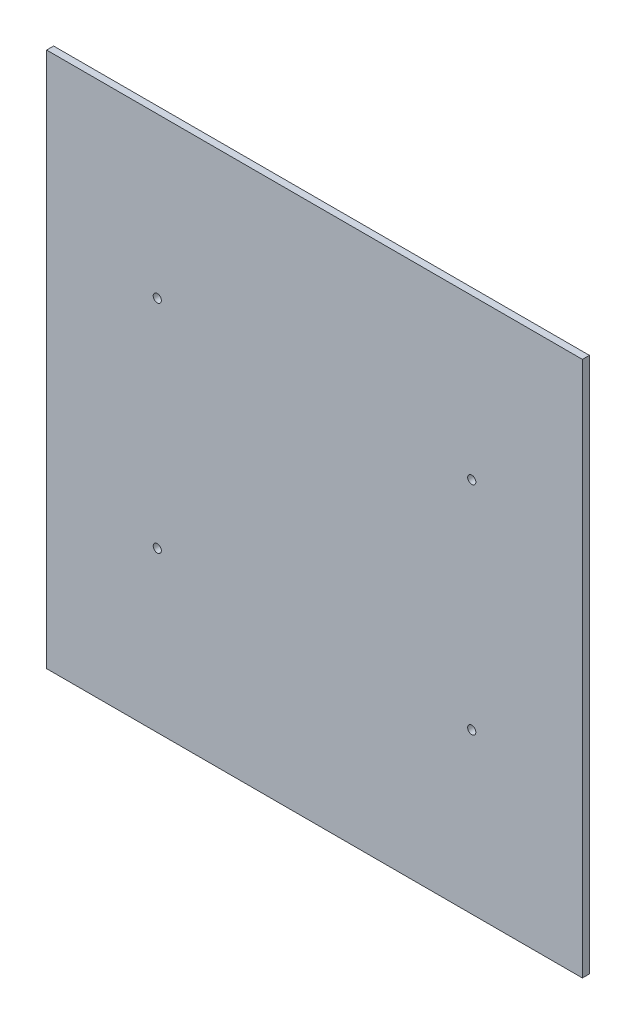
ISO-10303-21;
HEADER;
FILE_DESCRIPTION(('STEP AP214'),'2;1');
FILE_NAME('part.step','',(''),(''),'','','');
FILE_SCHEMA(('AUTOMOTIVE_DESIGN { 1 0 10303 214 1 1 1 1 }'));
ENDSEC;
DATA;
#1=APPLICATION_CONTEXT('core data for automotive mechanical design processes');
#2=APPLICATION_PROTOCOL_DEFINITION('international standard','automotive_design',2000,#1);
#3=PRODUCT_CONTEXT('',#1,'mechanical');
#4=PRODUCT('Part','Part','',(#3));
#5=PRODUCT_RELATED_PRODUCT_CATEGORY('part','',(#4));
#6=PRODUCT_DEFINITION_FORMATION('','',#4);
#7=PRODUCT_DEFINITION_CONTEXT('part definition',#1,'design');
#8=PRODUCT_DEFINITION('design','',#6,#7);
#9=PRODUCT_DEFINITION_SHAPE('','',#8);
#10=(LENGTH_UNIT() NAMED_UNIT(*) SI_UNIT(.MILLI.,.METRE.));
#11=(NAMED_UNIT(*) PLANE_ANGLE_UNIT() SI_UNIT($,.RADIAN.));
#12=(NAMED_UNIT(*) SI_UNIT($,.STERADIAN.) SOLID_ANGLE_UNIT());
#13=UNCERTAINTY_MEASURE_WITH_UNIT(LENGTH_MEASURE(1.E-05),#10,'distance_accuracy_value','');
#14=(GEOMETRIC_REPRESENTATION_CONTEXT(3) GLOBAL_UNCERTAINTY_ASSIGNED_CONTEXT((#13)) GLOBAL_UNIT_ASSIGNED_CONTEXT((#10,
#11,#12)) REPRESENTATION_CONTEXT('',''));
#15=CARTESIAN_POINT('',(0.,0.,0.));
#16=DIRECTION('',(0.,0.,1.));
#17=DIRECTION('',(1.,0.,0.));
#18=AXIS2_PLACEMENT_3D('',#15,#16,#17);
#19=CARTESIAN_POINT('',(-198.312913378607,43.3479344980651,3.));
#20=DIRECTION('',(1.,0.,0.));
#21=DIRECTION('',(0.,1.,0.));
#22=AXIS2_PLACEMENT_3D('',#19,#20,#21);
#23=PLANE('',#22);
#24=DIRECTION('',(0.,-1.,0.));
#25=VECTOR('',#24,1.);
#26=CARTESIAN_POINT('',(-198.312913378607,43.3479344980651,0.));
#27=LINE('',#26,#25);
#28=CARTESIAN_POINT('',(-198.312913378607,43.3479344980651,0.));
#29=VERTEX_POINT('',#28);
#30=CARTESIAN_POINT('',(-198.312913378607,-186.652065501935,0.));
#31=VERTEX_POINT('',#30);
#32=EDGE_CURVE('E98',#29,#31,#27,.T.);
#33=ORIENTED_EDGE('',*,*,#32,.T.);
#34=DIRECTION('',(0.,0.,-1.));
#35=VECTOR('',#34,1.);
#36=CARTESIAN_POINT('',(-198.312913378607,-186.652065501935,3.));
#37=LINE('',#36,#35);
#38=CARTESIAN_POINT('',(-198.312913378607,-186.652065501935,3.));
#39=VERTEX_POINT('',#38);
#40=EDGE_CURVE('E11',#39,#31,#37,.T.);
#41=ORIENTED_EDGE('',*,*,#40,.F.);
#42=DIRECTION('',(0.,-1.,0.));
#43=VECTOR('',#42,1.);
#44=CARTESIAN_POINT('',(-198.312913378607,43.3479344980651,3.));
#45=LINE('',#44,#43);
#46=CARTESIAN_POINT('',(-198.312913378607,43.3479344980651,3.));
#47=VERTEX_POINT('',#46);
#48=EDGE_CURVE('E85',#47,#39,#45,.T.);
#49=ORIENTED_EDGE('',*,*,#48,.F.);
#50=DIRECTION('',(0.,0.,-1.));
#51=VECTOR('',#50,1.);
#52=CARTESIAN_POINT('',(-198.312913378607,43.3479344980651,3.));
#53=LINE('',#52,#51);
#54=EDGE_CURVE('E94',#47,#29,#53,.T.);
#55=ORIENTED_EDGE('',*,*,#54,.T.);
#56=EDGE_LOOP('',(#33,#41,#49,#55));
#57=FACE_BOUND('',#56,.T.);
#58=ADVANCED_FACE('F32',(#57),#23,.F.);
#59=CARTESIAN_POINT('',(-198.312913378607,-186.652065501935,3.));
#60=DIRECTION('',(0.,1.,0.));
#61=DIRECTION('',(0.,0.,1.));
#62=AXIS2_PLACEMENT_3D('',#59,#60,#61);
#63=PLANE('',#62);
#64=DIRECTION('',(1.,0.,0.));
#65=VECTOR('',#64,1.);
#66=CARTESIAN_POINT('',(-198.312913378607,-186.652065501935,0.));
#67=LINE('',#66,#65);
#68=CARTESIAN_POINT('',(31.6870866213926,-186.652065501935,0.));
#69=VERTEX_POINT('',#68);
#70=EDGE_CURVE('E89',#31,#69,#67,.T.);
#71=ORIENTED_EDGE('',*,*,#70,.T.);
#72=DIRECTION('',(0.,0.,-1.));
#73=VECTOR('',#72,1.);
#74=CARTESIAN_POINT('',(31.6870866213926,-186.652065501935,3.));
#75=LINE('',#74,#73);
#76=CARTESIAN_POINT('',(31.6870866213926,-186.652065501935,3.));
#77=VERTEX_POINT('',#76);
#78=EDGE_CURVE('E41',#77,#69,#75,.T.);
#79=ORIENTED_EDGE('',*,*,#78,.F.);
#80=DIRECTION('',(1.,0.,0.));
#81=VECTOR('',#80,1.);
#82=CARTESIAN_POINT('',(-198.312913378607,-186.652065501935,3.));
#83=LINE('',#82,#81);
#84=EDGE_CURVE('E80',#39,#77,#83,.T.);
#85=ORIENTED_EDGE('',*,*,#84,.F.);
#86=ORIENTED_EDGE('',*,*,#40,.T.);
#87=EDGE_LOOP('',(#71,#79,#85,#86));
#88=FACE_BOUND('',#87,.T.);
#89=ADVANCED_FACE('F88',(#88),#63,.F.);
#90=CARTESIAN_POINT('',(31.6870866213926,43.3479344980651,3.));
#91=DIRECTION('',(-1.,0.,0.));
#92=DIRECTION('',(0.,-1.,0.));
#93=AXIS2_PLACEMENT_3D('',#90,#91,#92);
#94=PLANE('',#93);
#95=DIRECTION('',(0.,1.,0.));
#96=VECTOR('',#95,1.);
#97=CARTESIAN_POINT('',(31.6870866213926,43.3479344980651,0.));
#98=LINE('',#97,#96);
#99=CARTESIAN_POINT('',(31.6870866213926,43.3479344980651,0.));
#100=VERTEX_POINT('',#99);
#101=EDGE_CURVE('E67',#69,#100,#98,.T.);
#102=ORIENTED_EDGE('',*,*,#101,.T.);
#103=DIRECTION('',(0.,0.,-1.));
#104=VECTOR('',#103,1.);
#105=CARTESIAN_POINT('',(31.6870866213926,43.3479344980651,3.));
#106=LINE('',#105,#104);
#107=CARTESIAN_POINT('',(31.6870866213926,43.3479344980651,3.));
#108=VERTEX_POINT('',#107);
#109=EDGE_CURVE('E90',#108,#100,#106,.T.);
#110=ORIENTED_EDGE('',*,*,#109,.F.);
#111=DIRECTION('',(0.,1.,0.));
#112=VECTOR('',#111,1.);
#113=CARTESIAN_POINT('',(31.6870866213926,43.3479344980651,3.));
#114=LINE('',#113,#112);
#115=EDGE_CURVE('E83',#77,#108,#114,.T.);
#116=ORIENTED_EDGE('',*,*,#115,.F.);
#117=ORIENTED_EDGE('',*,*,#78,.T.);
#118=EDGE_LOOP('',(#102,#110,#116,#117));
#119=FACE_BOUND('',#118,.T.);
#120=ADVANCED_FACE('F92',(#119),#94,.F.);
#121=CARTESIAN_POINT('',(-198.312913378607,43.3479344980651,3.));
#122=DIRECTION('',(0.,-1.,0.));
#123=DIRECTION('',(0.,0.,-1.));
#124=AXIS2_PLACEMENT_3D('',#121,#122,#123);
#125=PLANE('',#124);
#126=DIRECTION('',(-1.,0.,0.));
#127=VECTOR('',#126,1.);
#128=CARTESIAN_POINT('',(-198.312913378607,43.3479344980651,0.));
#129=LINE('',#128,#127);
#130=EDGE_CURVE('E73',#100,#29,#129,.T.);
#131=ORIENTED_EDGE('',*,*,#130,.T.);
#132=ORIENTED_EDGE('',*,*,#54,.F.);
#133=DIRECTION('',(-1.,0.,0.));
#134=VECTOR('',#133,1.);
#135=CARTESIAN_POINT('',(-198.312913378607,43.3479344980651,3.));
#136=LINE('',#135,#134);
#137=EDGE_CURVE('E50',#108,#47,#136,.T.);
#138=ORIENTED_EDGE('',*,*,#137,.F.);
#139=ORIENTED_EDGE('',*,*,#109,.T.);
#140=EDGE_LOOP('',(#131,#132,#138,#139));
#141=FACE_BOUND('',#140,.T.);
#142=ADVANCED_FACE('F136',(#141),#125,.F.);
#143=CARTESIAN_POINT('',(0.,0.,3.));
#144=DIRECTION('',(0.,0.,1.));
#145=DIRECTION('',(1.,0.,0.));
#146=AXIS2_PLACEMENT_3D('',#143,#144,#145);
#147=PLANE('',#146);
#148=CARTESIAN_POINT('',(-150.812913378607,-25.1520655019349,3.));
#149=DIRECTION('',(0.,0.,1.));
#150=DIRECTION('',(1.,0.,0.));
#151=AXIS2_PLACEMENT_3D('',#148,#149,#150);
#152=CIRCLE('',#151,1.75000000000001);
#153=CARTESIAN_POINT('',(-149.062913378607,-25.1520655019349,3.));
#154=VERTEX_POINT('',#153);
#155=EDGE_CURVE('E125',#154,#154,#152,.T.);
#156=ORIENTED_EDGE('',*,*,#155,.F.);
#157=EDGE_LOOP('',(#156));
#158=FACE_BOUND('',#157,.T.);
#159=CARTESIAN_POINT('',(-150.812913378607,-118.152065501935,3.));
#160=DIRECTION('',(0.,0.,1.));
#161=DIRECTION('',(1.,0.,0.));
#162=AXIS2_PLACEMENT_3D('',#159,#160,#161);
#163=CIRCLE('',#162,1.75000000000001);
#164=CARTESIAN_POINT('',(-149.062913378607,-118.152065501935,3.));
#165=VERTEX_POINT('',#164);
#166=EDGE_CURVE('E115',#165,#165,#163,.T.);
#167=ORIENTED_EDGE('',*,*,#166,.F.);
#168=EDGE_LOOP('',(#167));
#169=FACE_BOUND('',#168,.T.);
#170=CARTESIAN_POINT('',(-15.8129133786074,-118.152065501935,3.));
#171=DIRECTION('',(0.,0.,1.));
#172=DIRECTION('',(1.,0.,0.));
#173=AXIS2_PLACEMENT_3D('',#170,#171,#172);
#174=CIRCLE('',#173,1.75);
#175=CARTESIAN_POINT('',(-14.0629133786074,-118.152065501935,3.));
#176=VERTEX_POINT('',#175);
#177=EDGE_CURVE('E112',#176,#176,#174,.T.);
#178=ORIENTED_EDGE('',*,*,#177,.F.);
#179=EDGE_LOOP('',(#178));
#180=FACE_BOUND('',#179,.T.);
#181=CARTESIAN_POINT('',(-15.8129133786074,-25.1520655019349,3.));
#182=DIRECTION('',(0.,0.,1.));
#183=DIRECTION('',(1.,0.,0.));
#184=AXIS2_PLACEMENT_3D('',#181,#182,#183);
#185=CIRCLE('',#184,1.75);
#186=CARTESIAN_POINT('',(-14.0629133786074,-25.1520655019349,3.));
#187=VERTEX_POINT('',#186);
#188=EDGE_CURVE('E109',#187,#187,#185,.T.);
#189=ORIENTED_EDGE('',*,*,#188,.F.);
#190=EDGE_LOOP('',(#189));
#191=FACE_BOUND('',#190,.T.);
#192=ORIENTED_EDGE('',*,*,#48,.T.);
#193=ORIENTED_EDGE('',*,*,#84,.T.);
#194=ORIENTED_EDGE('',*,*,#115,.T.);
#195=ORIENTED_EDGE('',*,*,#137,.T.);
#196=EDGE_LOOP('',(#192,#193,#194,#195));
#197=FACE_BOUND('',#196,.T.);
#198=ADVANCED_FACE('F81',(#158,#169,#180,#191,#197),#147,.T.);
#199=CARTESIAN_POINT('',(0.,0.,0.));
#200=DIRECTION('',(0.,0.,1.));
#201=DIRECTION('',(1.,0.,0.));
#202=AXIS2_PLACEMENT_3D('',#199,#200,#201);
#203=PLANE('',#202);
#204=CARTESIAN_POINT('',(-150.812913378607,-25.1520655019349,0.));
#205=DIRECTION('',(0.,0.,1.));
#206=DIRECTION('',(1.,0.,0.));
#207=AXIS2_PLACEMENT_3D('',#204,#205,#206);
#208=CIRCLE('',#207,1.75000000000001);
#209=CARTESIAN_POINT('',(-149.062913378607,-25.1520655019349,0.));
#210=VERTEX_POINT('',#209);
#211=EDGE_CURVE('E35',#210,#210,#208,.T.);
#212=ORIENTED_EDGE('',*,*,#211,.T.);
#213=EDGE_LOOP('',(#212));
#214=FACE_BOUND('',#213,.T.);
#215=CARTESIAN_POINT('',(-150.812913378607,-118.152065501935,0.));
#216=DIRECTION('',(0.,0.,1.));
#217=DIRECTION('',(1.,0.,0.));
#218=AXIS2_PLACEMENT_3D('',#215,#216,#217);
#219=CIRCLE('',#218,1.75000000000001);
#220=CARTESIAN_POINT('',(-149.062913378607,-118.152065501935,0.));
#221=VERTEX_POINT('',#220);
#222=EDGE_CURVE('E113',#221,#221,#219,.T.);
#223=ORIENTED_EDGE('',*,*,#222,.T.);
#224=EDGE_LOOP('',(#223));
#225=FACE_BOUND('',#224,.T.);
#226=CARTESIAN_POINT('',(-15.8129133786074,-118.152065501935,0.));
#227=DIRECTION('',(0.,0.,1.));
#228=DIRECTION('',(1.,0.,0.));
#229=AXIS2_PLACEMENT_3D('',#226,#227,#228);
#230=CIRCLE('',#229,1.75);
#231=CARTESIAN_POINT('',(-14.0629133786074,-118.152065501935,0.));
#232=VERTEX_POINT('',#231);
#233=EDGE_CURVE('E110',#232,#232,#230,.T.);
#234=ORIENTED_EDGE('',*,*,#233,.T.);
#235=EDGE_LOOP('',(#234));
#236=FACE_BOUND('',#235,.T.);
#237=CARTESIAN_POINT('',(-15.8129133786074,-25.1520655019349,0.));
#238=DIRECTION('',(0.,0.,1.));
#239=DIRECTION('',(1.,0.,0.));
#240=AXIS2_PLACEMENT_3D('',#237,#238,#239);
#241=CIRCLE('',#240,1.75);
#242=CARTESIAN_POINT('',(-14.0629133786074,-25.1520655019349,0.));
#243=VERTEX_POINT('',#242);
#244=EDGE_CURVE('E101',#243,#243,#241,.T.);
#245=ORIENTED_EDGE('',*,*,#244,.T.);
#246=EDGE_LOOP('',(#245));
#247=FACE_BOUND('',#246,.T.);
#248=ORIENTED_EDGE('',*,*,#32,.F.);
#249=ORIENTED_EDGE('',*,*,#130,.F.);
#250=ORIENTED_EDGE('',*,*,#101,.F.);
#251=ORIENTED_EDGE('',*,*,#70,.F.);
#252=EDGE_LOOP('',(#248,#249,#250,#251));
#253=FACE_BOUND('',#252,.T.);
#254=ADVANCED_FACE('F135',(#214,#225,#236,#247,#253),#203,.F.);
#255=CARTESIAN_POINT('',(-15.8129133786074,-25.1520655019349,-7.));
#256=DIRECTION('',(0.,0.,1.));
#257=DIRECTION('',(1.,0.,0.));
#258=AXIS2_PLACEMENT_3D('',#255,#256,#257);
#259=CYLINDRICAL_SURFACE('',#258,1.75);
#260=ORIENTED_EDGE('',*,*,#188,.T.);
#261=EDGE_LOOP('',(#260));
#262=FACE_BOUND('',#261,.T.);
#263=ORIENTED_EDGE('',*,*,#244,.F.);
#264=EDGE_LOOP('',(#263));
#265=FACE_BOUND('',#264,.T.);
#266=ADVANCED_FACE('F131',(#262,#265),#259,.F.);
#267=CARTESIAN_POINT('',(-15.8129133786074,-118.152065501935,-7.));
#268=DIRECTION('',(0.,0.,1.));
#269=DIRECTION('',(1.,0.,0.));
#270=AXIS2_PLACEMENT_3D('',#267,#268,#269);
#271=CYLINDRICAL_SURFACE('',#270,1.75);
#272=ORIENTED_EDGE('',*,*,#177,.T.);
#273=EDGE_LOOP('',(#272));
#274=FACE_BOUND('',#273,.T.);
#275=ORIENTED_EDGE('',*,*,#233,.F.);
#276=EDGE_LOOP('',(#275));
#277=FACE_BOUND('',#276,.T.);
#278=ADVANCED_FACE('F183',(#274,#277),#271,.F.);
#279=CARTESIAN_POINT('',(-150.812913378607,-118.152065501935,-7.));
#280=DIRECTION('',(0.,0.,1.));
#281=DIRECTION('',(1.,0.,0.));
#282=AXIS2_PLACEMENT_3D('',#279,#280,#281);
#283=CYLINDRICAL_SURFACE('',#282,1.75000000000001);
#284=ORIENTED_EDGE('',*,*,#166,.T.);
#285=EDGE_LOOP('',(#284));
#286=FACE_BOUND('',#285,.T.);
#287=ORIENTED_EDGE('',*,*,#222,.F.);
#288=EDGE_LOOP('',(#287));
#289=FACE_BOUND('',#288,.T.);
#290=ADVANCED_FACE('F188',(#286,#289),#283,.F.);
#291=CARTESIAN_POINT('',(-150.812913378607,-25.1520655019349,-7.));
#292=DIRECTION('',(0.,0.,1.));
#293=DIRECTION('',(1.,0.,0.));
#294=AXIS2_PLACEMENT_3D('',#291,#292,#293);
#295=CYLINDRICAL_SURFACE('',#294,1.75000000000001);
#296=ORIENTED_EDGE('',*,*,#155,.T.);
#297=EDGE_LOOP('',(#296));
#298=FACE_BOUND('',#297,.T.);
#299=ORIENTED_EDGE('',*,*,#211,.F.);
#300=EDGE_LOOP('',(#299));
#301=FACE_BOUND('',#300,.T.);
#302=ADVANCED_FACE('F196',(#298,#301),#295,.F.);
#303=CLOSED_SHELL('',(#58,#89,#120,#142,#198,#254,#266,#278,#290,#302));
#304=MANIFOLD_SOLID_BREP('B2',#303);
#305=ADVANCED_BREP_SHAPE_REPRESENTATION('',(#18,#304),#14);
#306=SHAPE_DEFINITION_REPRESENTATION(#9,#305);
ENDSEC;
END-ISO-10303-21;
